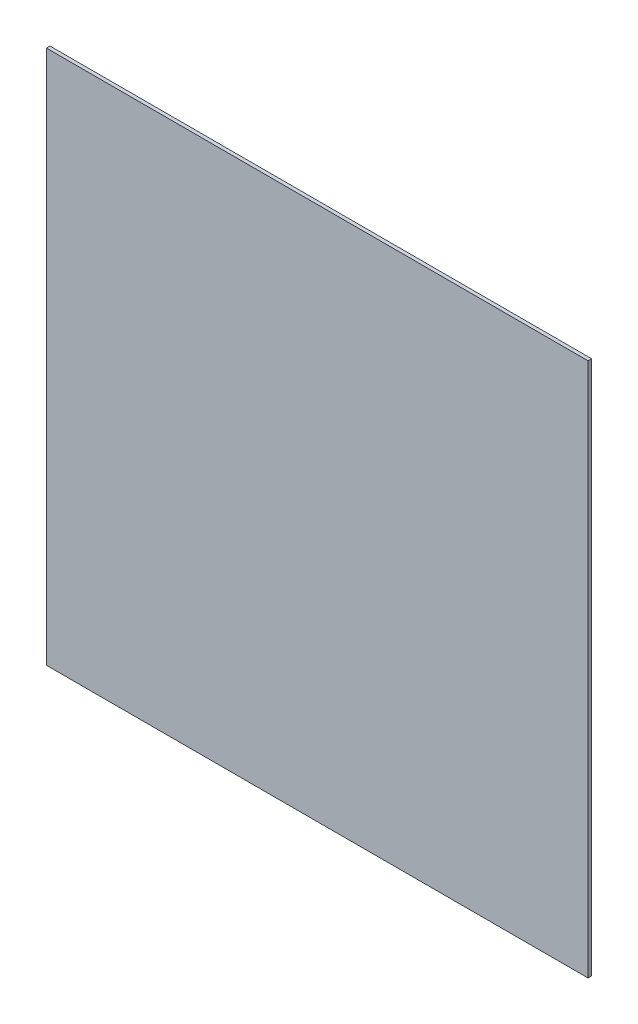
ISO-10303-21;
HEADER;
FILE_DESCRIPTION(('STEP AP214'),'2;1');
FILE_NAME('part.step','',(''),(''),'','','');
FILE_SCHEMA(('AUTOMOTIVE_DESIGN { 1 0 10303 214 1 1 1 1 }'));
ENDSEC;
DATA;
#1=APPLICATION_CONTEXT('core data for automotive mechanical design processes');
#2=APPLICATION_PROTOCOL_DEFINITION('international standard','automotive_design',2000,#1);
#3=PRODUCT_CONTEXT('',#1,'mechanical');
#4=PRODUCT('Part','Part','',(#3));
#5=PRODUCT_RELATED_PRODUCT_CATEGORY('part','',(#4));
#6=PRODUCT_DEFINITION_FORMATION('','',#4);
#7=PRODUCT_DEFINITION_CONTEXT('part definition',#1,'design');
#8=PRODUCT_DEFINITION('design','',#6,#7);
#9=PRODUCT_DEFINITION_SHAPE('','',#8);
#10=(LENGTH_UNIT() NAMED_UNIT(*) SI_UNIT(.MILLI.,.METRE.));
#11=(NAMED_UNIT(*) PLANE_ANGLE_UNIT() SI_UNIT($,.RADIAN.));
#12=(NAMED_UNIT(*) SI_UNIT($,.STERADIAN.) SOLID_ANGLE_UNIT());
#13=UNCERTAINTY_MEASURE_WITH_UNIT(LENGTH_MEASURE(1.E-05),#10,'distance_accuracy_value','');
#14=(GEOMETRIC_REPRESENTATION_CONTEXT(3) GLOBAL_UNCERTAINTY_ASSIGNED_CONTEXT((#13)) GLOBAL_UNIT_ASSIGNED_CONTEXT((#10,
#11,#12)) REPRESENTATION_CONTEXT('',''));
#15=CARTESIAN_POINT('',(0.,0.,0.));
#16=DIRECTION('',(0.,0.,1.));
#17=DIRECTION('',(1.,0.,0.));
#18=AXIS2_PLACEMENT_3D('',#15,#16,#17);
#19=CARTESIAN_POINT('',(0.,0.,10.));
#20=DIRECTION('',(1.,0.,0.));
#21=DIRECTION('',(0.,0.,-1.));
#22=AXIS2_PLACEMENT_3D('',#19,#20,#21);
#23=PLANE('',#22);
#24=DIRECTION('',(0.,-1.,0.));
#25=VECTOR('',#24,1.);
#26=CARTESIAN_POINT('',(0.,0.,0.));
#27=LINE('',#26,#25);
#28=CARTESIAN_POINT('',(0.,1500.,0.));
#29=VERTEX_POINT('',#28);
#30=CARTESIAN_POINT('',(0.,0.,0.));
#31=VERTEX_POINT('',#30);
#32=EDGE_CURVE('E107',#29,#31,#27,.T.);
#33=ORIENTED_EDGE('',*,*,#32,.T.);
#34=DIRECTION('',(0.,0.,-1.));
#35=VECTOR('',#34,1.);
#36=CARTESIAN_POINT('',(0.,0.,10.));
#37=LINE('',#36,#35);
#38=CARTESIAN_POINT('',(0.,0.,10.));
#39=VERTEX_POINT('',#38);
#40=EDGE_CURVE('E11',#39,#31,#37,.T.);
#41=ORIENTED_EDGE('',*,*,#40,.F.);
#42=DIRECTION('',(0.,-1.,0.));
#43=VECTOR('',#42,1.);
#44=CARTESIAN_POINT('',(0.,0.,10.));
#45=LINE('',#44,#43);
#46=CARTESIAN_POINT('',(0.,1500.,10.));
#47=VERTEX_POINT('',#46);
#48=EDGE_CURVE('E91',#47,#39,#45,.T.);
#49=ORIENTED_EDGE('',*,*,#48,.F.);
#50=DIRECTION('',(0.,0.,-1.));
#51=VECTOR('',#50,1.);
#52=CARTESIAN_POINT('',(0.,1500.,10.));
#53=LINE('',#52,#51);
#54=EDGE_CURVE('E103',#47,#29,#53,.T.);
#55=ORIENTED_EDGE('',*,*,#54,.T.);
#56=EDGE_LOOP('',(#33,#41,#49,#55));
#57=FACE_BOUND('',#56,.T.);
#58=ADVANCED_FACE('F39',(#57),#23,.F.);
#59=CARTESIAN_POINT('',(0.,0.,10.));
#60=DIRECTION('',(0.,1.,0.));
#61=DIRECTION('',(0.,0.,1.));
#62=AXIS2_PLACEMENT_3D('',#59,#60,#61);
#63=PLANE('',#62);
#64=DIRECTION('',(1.,0.,0.));
#65=VECTOR('',#64,1.);
#66=CARTESIAN_POINT('',(0.,0.,0.));
#67=LINE('',#66,#65);
#68=CARTESIAN_POINT('',(1520.,0.,0.));
#69=VERTEX_POINT('',#68);
#70=EDGE_CURVE('E96',#31,#69,#67,.T.);
#71=ORIENTED_EDGE('',*,*,#70,.T.);
#72=DIRECTION('',(0.,0.,-1.));
#73=VECTOR('',#72,1.);
#74=CARTESIAN_POINT('',(1520.,0.,10.));
#75=LINE('',#74,#73);
#76=CARTESIAN_POINT('',(1520.,0.,10.));
#77=VERTEX_POINT('',#76);
#78=EDGE_CURVE('E48',#77,#69,#75,.T.);
#79=ORIENTED_EDGE('',*,*,#78,.F.);
#80=DIRECTION('',(1.,0.,0.));
#81=VECTOR('',#80,1.);
#82=CARTESIAN_POINT('',(0.,0.,10.));
#83=LINE('',#82,#81);
#84=EDGE_CURVE('E86',#39,#77,#83,.T.);
#85=ORIENTED_EDGE('',*,*,#84,.F.);
#86=ORIENTED_EDGE('',*,*,#40,.T.);
#87=EDGE_LOOP('',(#71,#79,#85,#86));
#88=FACE_BOUND('',#87,.T.);
#89=ADVANCED_FACE('F95',(#88),#63,.F.);
#90=CARTESIAN_POINT('',(1520.,0.,10.));
#91=DIRECTION('',(-1.,0.,0.));
#92=DIRECTION('',(0.,0.,1.));
#93=AXIS2_PLACEMENT_3D('',#90,#91,#92);
#94=PLANE('',#93);
#95=DIRECTION('',(0.,1.,0.));
#96=VECTOR('',#95,1.);
#97=CARTESIAN_POINT('',(1520.,0.,0.));
#98=LINE('',#97,#96);
#99=CARTESIAN_POINT('',(1520.,1500.,0.));
#100=VERTEX_POINT('',#99);
#101=EDGE_CURVE('E73',#69,#100,#98,.T.);
#102=ORIENTED_EDGE('',*,*,#101,.T.);
#103=DIRECTION('',(0.,0.,-1.));
#104=VECTOR('',#103,1.);
#105=CARTESIAN_POINT('',(1520.,1500.,10.));
#106=LINE('',#105,#104);
#107=CARTESIAN_POINT('',(1520.,1500.,10.));
#108=VERTEX_POINT('',#107);
#109=EDGE_CURVE('E98',#108,#100,#106,.T.);
#110=ORIENTED_EDGE('',*,*,#109,.F.);
#111=DIRECTION('',(0.,1.,0.));
#112=VECTOR('',#111,1.);
#113=CARTESIAN_POINT('',(1520.,0.,10.));
#114=LINE('',#113,#112);
#115=EDGE_CURVE('E89',#77,#108,#114,.T.);
#116=ORIENTED_EDGE('',*,*,#115,.F.);
#117=ORIENTED_EDGE('',*,*,#78,.T.);
#118=EDGE_LOOP('',(#102,#110,#116,#117));
#119=FACE_BOUND('',#118,.T.);
#120=ADVANCED_FACE('F99',(#119),#94,.F.);
#121=CARTESIAN_POINT('',(0.,1500.,10.));
#122=DIRECTION('',(0.,-1.,0.));
#123=DIRECTION('',(0.,0.,-1.));
#124=AXIS2_PLACEMENT_3D('',#121,#122,#123);
#125=PLANE('',#124);
#126=DIRECTION('',(-1.,0.,0.));
#127=VECTOR('',#126,1.);
#128=CARTESIAN_POINT('',(0.,1500.,0.));
#129=LINE('',#128,#127);
#130=EDGE_CURVE('E79',#100,#29,#129,.T.);
#131=ORIENTED_EDGE('',*,*,#130,.T.);
#132=ORIENTED_EDGE('',*,*,#54,.F.);
#133=DIRECTION('',(-1.,0.,0.));
#134=VECTOR('',#133,1.);
#135=CARTESIAN_POINT('',(0.,1500.,10.));
#136=LINE('',#135,#134);
#137=EDGE_CURVE('E56',#108,#47,#136,.T.);
#138=ORIENTED_EDGE('',*,*,#137,.F.);
#139=ORIENTED_EDGE('',*,*,#109,.T.);
#140=EDGE_LOOP('',(#131,#132,#138,#139));
#141=FACE_BOUND('',#140,.T.);
#142=ADVANCED_FACE('F120',(#141),#125,.F.);
#143=CARTESIAN_POINT('',(0.,0.,10.));
#144=DIRECTION('',(0.,0.,-1.));
#145=DIRECTION('',(-1.,0.,0.));
#146=AXIS2_PLACEMENT_3D('',#143,#144,#145);
#147=PLANE('',#146);
#148=ORIENTED_EDGE('',*,*,#48,.T.);
#149=ORIENTED_EDGE('',*,*,#84,.T.);
#150=ORIENTED_EDGE('',*,*,#115,.T.);
#151=ORIENTED_EDGE('',*,*,#137,.T.);
#152=EDGE_LOOP('',(#148,#149,#150,#151));
#153=FACE_BOUND('',#152,.T.);
#154=ADVANCED_FACE('F87',(#153),#147,.F.);
#155=CARTESIAN_POINT('',(0.,0.,0.));
#156=DIRECTION('',(0.,0.,-1.));
#157=DIRECTION('',(-1.,0.,0.));
#158=AXIS2_PLACEMENT_3D('',#155,#156,#157);
#159=PLANE('',#158);
#160=ORIENTED_EDGE('',*,*,#32,.F.);
#161=ORIENTED_EDGE('',*,*,#130,.F.);
#162=ORIENTED_EDGE('',*,*,#101,.F.);
#163=ORIENTED_EDGE('',*,*,#70,.F.);
#164=EDGE_LOOP('',(#160,#161,#162,#163));
#165=FACE_BOUND('',#164,.T.);
#166=ADVANCED_FACE('F123',(#165),#159,.T.);
#167=CLOSED_SHELL('',(#58,#89,#120,#142,#154,#166));
#168=MANIFOLD_SOLID_BREP('B2',#167);
#169=ADVANCED_BREP_SHAPE_REPRESENTATION('',(#18,#168),#14);
#170=SHAPE_DEFINITION_REPRESENTATION(#9,#169);
ENDSEC;
END-ISO-10303-21;
